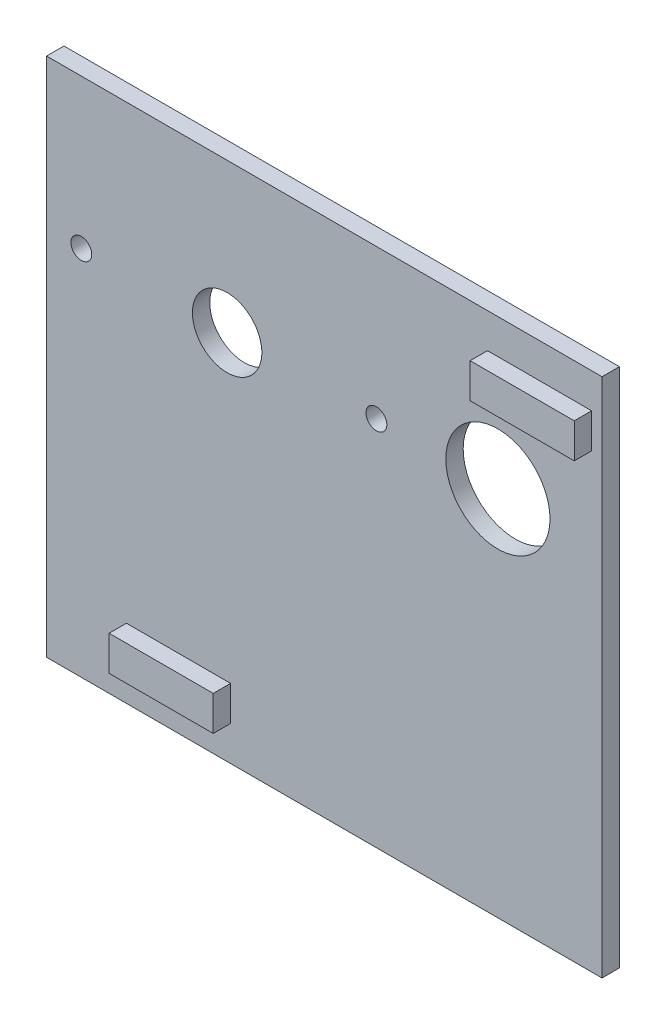
ISO-10303-21;
HEADER;
FILE_DESCRIPTION(('STEP AP214'),'2;1');
FILE_NAME('part.step','',(''),(''),'','','');
FILE_SCHEMA(('AUTOMOTIVE_DESIGN { 1 0 10303 214 1 1 1 1 }'));
ENDSEC;
DATA;
#1=APPLICATION_CONTEXT('core data for automotive mechanical design processes');
#2=APPLICATION_PROTOCOL_DEFINITION('international standard','automotive_design',2000,#1);
#3=PRODUCT_CONTEXT('',#1,'mechanical');
#4=PRODUCT('Part','Part','',(#3));
#5=PRODUCT_RELATED_PRODUCT_CATEGORY('part','',(#4));
#6=PRODUCT_DEFINITION_FORMATION('','',#4);
#7=PRODUCT_DEFINITION_CONTEXT('part definition',#1,'design');
#8=PRODUCT_DEFINITION('design','',#6,#7);
#9=PRODUCT_DEFINITION_SHAPE('','',#8);
#10=(LENGTH_UNIT() NAMED_UNIT(*) SI_UNIT(.MILLI.,.METRE.));
#11=(NAMED_UNIT(*) PLANE_ANGLE_UNIT() SI_UNIT($,.RADIAN.));
#12=(NAMED_UNIT(*) SI_UNIT($,.STERADIAN.) SOLID_ANGLE_UNIT());
#13=UNCERTAINTY_MEASURE_WITH_UNIT(LENGTH_MEASURE(1.E-05),#10,'distance_accuracy_value','');
#14=(GEOMETRIC_REPRESENTATION_CONTEXT(3) GLOBAL_UNCERTAINTY_ASSIGNED_CONTEXT((#13)) GLOBAL_UNIT_ASSIGNED_CONTEXT((#10,
#11,#12)) REPRESENTATION_CONTEXT('',''));
#15=CARTESIAN_POINT('',(0.,0.,0.));
#16=DIRECTION('',(0.,0.,1.));
#17=DIRECTION('',(1.,0.,0.));
#18=AXIS2_PLACEMENT_3D('',#15,#16,#17);
#19=CARTESIAN_POINT('',(0.,0.,5.));
#20=DIRECTION('',(0.,0.,-1.));
#21=DIRECTION('',(-1.,0.,0.));
#22=AXIS2_PLACEMENT_3D('',#19,#20,#21);
#23=PLANE('',#22);
#24=CARTESIAN_POINT('',(-150.,-43.,5.));
#25=DIRECTION('',(0.,0.,-1.));
#26=DIRECTION('',(-1.,0.,0.));
#27=AXIS2_PLACEMENT_3D('',#24,#25,#26);
#28=CIRCLE('',#27,2.99999999999999);
#29=CARTESIAN_POINT('',(-153.,-43.,5.));
#30=VERTEX_POINT('',#29);
#31=EDGE_CURVE('E231',#30,#30,#28,.T.);
#32=ORIENTED_EDGE('',*,*,#31,.T.);
#33=EDGE_LOOP('',(#32));
#34=FACE_BOUND('',#33,.T.);
#35=CARTESIAN_POINT('',(-108.,-43.,5.));
#36=DIRECTION('',(0.,0.,-1.));
#37=DIRECTION('',(-1.,0.,0.));
#38=AXIS2_PLACEMENT_3D('',#35,#36,#37);
#39=CIRCLE('',#38,9.99999999999999);
#40=CARTESIAN_POINT('',(-118.,-43.,5.));
#41=VERTEX_POINT('',#40);
#42=EDGE_CURVE('E220',#41,#41,#39,.T.);
#43=ORIENTED_EDGE('',*,*,#42,.T.);
#44=EDGE_LOOP('',(#43));
#45=FACE_BOUND('',#44,.T.);
#46=CARTESIAN_POINT('',(-65.,-43.,5.));
#47=DIRECTION('',(0.,0.,-1.));
#48=DIRECTION('',(-1.,0.,0.));
#49=AXIS2_PLACEMENT_3D('',#46,#47,#48);
#50=CIRCLE('',#49,3.00000000000001);
#51=CARTESIAN_POINT('',(-68.,-43.,5.));
#52=VERTEX_POINT('',#51);
#53=EDGE_CURVE('E217',#52,#52,#50,.T.);
#54=ORIENTED_EDGE('',*,*,#53,.T.);
#55=EDGE_LOOP('',(#54));
#56=FACE_BOUND('',#55,.T.);
#57=CARTESIAN_POINT('',(-30.,-43.,5.));
#58=DIRECTION('',(0.,0.,-1.));
#59=DIRECTION('',(-1.,0.,0.));
#60=AXIS2_PLACEMENT_3D('',#57,#58,#59);
#61=CIRCLE('',#60,15.);
#62=CARTESIAN_POINT('',(-45.,-43.,5.));
#63=VERTEX_POINT('',#62);
#64=EDGE_CURVE('E214',#63,#63,#61,.T.);
#65=ORIENTED_EDGE('',*,*,#64,.T.);
#66=EDGE_LOOP('',(#65));
#67=FACE_BOUND('',#66,.T.);
#68=DIRECTION('',(0.,-1.,0.));
#69=VECTOR('',#68,1.);
#70=CARTESIAN_POINT('',(-33.,-9.99999999999999,5.));
#71=LINE('',#70,#69);
#72=CARTESIAN_POINT('',(-33.,-9.99999999999999,5.));
#73=VERTEX_POINT('',#72);
#74=CARTESIAN_POINT('',(-33.,-20.,5.));
#75=VERTEX_POINT('',#74);
#76=EDGE_CURVE('E147',#73,#75,#71,.T.);
#77=ORIENTED_EDGE('',*,*,#76,.F.);
#78=DIRECTION('',(-1.,0.,0.));
#79=VECTOR('',#78,1.);
#80=CARTESIAN_POINT('',(-33.,-9.99999999999999,5.));
#81=LINE('',#80,#79);
#82=CARTESIAN_POINT('',(-2.99999999999998,-10.,5.));
#83=VERTEX_POINT('',#82);
#84=EDGE_CURVE('E160',#83,#73,#81,.T.);
#85=ORIENTED_EDGE('',*,*,#84,.F.);
#86=DIRECTION('',(0.,1.,0.));
#87=VECTOR('',#86,1.);
#88=CARTESIAN_POINT('',(-2.99999999999998,-10.,5.));
#89=LINE('',#88,#87);
#90=CARTESIAN_POINT('',(-2.99999999999999,-20.,5.));
#91=VERTEX_POINT('',#90);
#92=EDGE_CURVE('E169',#91,#83,#89,.T.);
#93=ORIENTED_EDGE('',*,*,#92,.F.);
#94=DIRECTION('',(1.,0.,0.));
#95=VECTOR('',#94,1.);
#96=CARTESIAN_POINT('',(-33.,-20.,5.));
#97=LINE('',#96,#95);
#98=EDGE_CURVE('E150',#75,#91,#97,.T.);
#99=ORIENTED_EDGE('',*,*,#98,.F.);
#100=EDGE_LOOP('',(#77,#85,#93,#99));
#101=FACE_BOUND('',#100,.T.);
#102=DIRECTION('',(0.,1.,0.));
#103=VECTOR('',#102,1.);
#104=CARTESIAN_POINT('',(0.,0.,5.));
#105=LINE('',#104,#103);
#106=CARTESIAN_POINT('',(0.,-150.,5.));
#107=VERTEX_POINT('',#106);
#108=CARTESIAN_POINT('',(0.,0.,5.));
#109=VERTEX_POINT('',#108);
#110=EDGE_CURVE('E186',#107,#109,#105,.T.);
#111=ORIENTED_EDGE('',*,*,#110,.T.);
#112=DIRECTION('',(-1.,0.,0.));
#113=VECTOR('',#112,1.);
#114=CARTESIAN_POINT('',(0.,0.,5.));
#115=LINE('',#114,#113);
#116=CARTESIAN_POINT('',(-160.,0.,5.));
#117=VERTEX_POINT('',#116);
#118=EDGE_CURVE('E189',#109,#117,#115,.T.);
#119=ORIENTED_EDGE('',*,*,#118,.T.);
#120=DIRECTION('',(0.,-1.,0.));
#121=VECTOR('',#120,1.);
#122=CARTESIAN_POINT('',(-160.,0.,5.));
#123=LINE('',#122,#121);
#124=CARTESIAN_POINT('',(-160.,-150.,5.));
#125=VERTEX_POINT('',#124);
#126=EDGE_CURVE('E192',#117,#125,#123,.T.);
#127=ORIENTED_EDGE('',*,*,#126,.T.);
#128=DIRECTION('',(1.,0.,0.));
#129=VECTOR('',#128,1.);
#130=CARTESIAN_POINT('',(0.,-150.,5.));
#131=LINE('',#130,#129);
#132=EDGE_CURVE('E194',#125,#107,#131,.T.);
#133=ORIENTED_EDGE('',*,*,#132,.T.);
#134=EDGE_LOOP('',(#111,#119,#127,#133));
#135=FACE_BOUND('',#134,.T.);
#136=DIRECTION('',(0.,-1.,0.));
#137=VECTOR('',#136,1.);
#138=CARTESIAN_POINT('',(-137.,-130.,5.));
#139=LINE('',#138,#137);
#140=CARTESIAN_POINT('',(-137.,-130.,5.));
#141=VERTEX_POINT('',#140);
#142=CARTESIAN_POINT('',(-137.,-140.,5.));
#143=VERTEX_POINT('',#142);
#144=EDGE_CURVE('E146',#141,#143,#139,.T.);
#145=ORIENTED_EDGE('',*,*,#144,.F.);
#146=DIRECTION('',(-1.,0.,0.));
#147=VECTOR('',#146,1.);
#148=CARTESIAN_POINT('',(-137.,-130.,5.));
#149=LINE('',#148,#147);
#150=CARTESIAN_POINT('',(-107.,-130.,5.));
#151=VERTEX_POINT('',#150);
#152=EDGE_CURVE('E143',#151,#141,#149,.T.);
#153=ORIENTED_EDGE('',*,*,#152,.F.);
#154=DIRECTION('',(0.,1.,0.));
#155=VECTOR('',#154,1.);
#156=CARTESIAN_POINT('',(-107.,-130.,5.));
#157=LINE('',#156,#155);
#158=CARTESIAN_POINT('',(-107.,-140.,5.));
#159=VERTEX_POINT('',#158);
#160=EDGE_CURVE('E57',#159,#151,#157,.T.);
#161=ORIENTED_EDGE('',*,*,#160,.F.);
#162=DIRECTION('',(1.,0.,0.));
#163=VECTOR('',#162,1.);
#164=CARTESIAN_POINT('',(-137.,-140.,5.));
#165=LINE('',#164,#163);
#166=EDGE_CURVE('E52',#143,#159,#165,.T.);
#167=ORIENTED_EDGE('',*,*,#166,.F.);
#168=EDGE_LOOP('',(#145,#153,#161,#167));
#169=FACE_BOUND('',#168,.T.);
#170=ADVANCED_FACE('F35',(#34,#45,#56,#67,#101,#135,#169),#23,.F.);
#171=CARTESIAN_POINT('',(0.,0.,5.));
#172=DIRECTION('',(-1.,0.,0.));
#173=DIRECTION('',(0.,-1.,0.));
#174=AXIS2_PLACEMENT_3D('',#171,#172,#173);
#175=PLANE('',#174);
#176=DIRECTION('',(0.,1.,0.));
#177=VECTOR('',#176,1.);
#178=CARTESIAN_POINT('',(0.,0.,0.));
#179=LINE('',#178,#177);
#180=CARTESIAN_POINT('',(0.,-150.,0.));
#181=VERTEX_POINT('',#180);
#182=CARTESIAN_POINT('',(0.,0.,0.));
#183=VERTEX_POINT('',#182);
#184=EDGE_CURVE('E185',#181,#183,#179,.T.);
#185=ORIENTED_EDGE('',*,*,#184,.T.);
#186=DIRECTION('',(0.,0.,-1.));
#187=VECTOR('',#186,1.);
#188=CARTESIAN_POINT('',(0.,0.,5.));
#189=LINE('',#188,#187);
#190=EDGE_CURVE('E11',#109,#183,#189,.T.);
#191=ORIENTED_EDGE('',*,*,#190,.F.);
#192=ORIENTED_EDGE('',*,*,#110,.F.);
#193=DIRECTION('',(0.,0.,-1.));
#194=VECTOR('',#193,1.);
#195=CARTESIAN_POINT('',(0.,-150.,5.));
#196=LINE('',#195,#194);
#197=EDGE_CURVE('E196',#107,#181,#196,.T.);
#198=ORIENTED_EDGE('',*,*,#197,.T.);
#199=EDGE_LOOP('',(#185,#191,#192,#198));
#200=FACE_BOUND('',#199,.T.);
#201=ADVANCED_FACE('F37',(#200),#175,.F.);
#202=CARTESIAN_POINT('',(0.,0.,5.));
#203=DIRECTION('',(0.,-1.,0.));
#204=DIRECTION('',(1.,0.,0.));
#205=AXIS2_PLACEMENT_3D('',#202,#203,#204);
#206=PLANE('',#205);
#207=DIRECTION('',(-1.,0.,0.));
#208=VECTOR('',#207,1.);
#209=CARTESIAN_POINT('',(0.,0.,0.));
#210=LINE('',#209,#208);
#211=CARTESIAN_POINT('',(-160.,0.,0.));
#212=VERTEX_POINT('',#211);
#213=EDGE_CURVE('E199',#183,#212,#210,.T.);
#214=ORIENTED_EDGE('',*,*,#213,.T.);
#215=DIRECTION('',(0.,0.,-1.));
#216=VECTOR('',#215,1.);
#217=CARTESIAN_POINT('',(-160.,0.,5.));
#218=LINE('',#217,#216);
#219=EDGE_CURVE('E44',#117,#212,#218,.T.);
#220=ORIENTED_EDGE('',*,*,#219,.F.);
#221=ORIENTED_EDGE('',*,*,#118,.F.);
#222=ORIENTED_EDGE('',*,*,#190,.T.);
#223=EDGE_LOOP('',(#214,#220,#221,#222));
#224=FACE_BOUND('',#223,.T.);
#225=ADVANCED_FACE('F262',(#224),#206,.F.);
#226=CARTESIAN_POINT('',(-160.,0.,5.));
#227=DIRECTION('',(1.,0.,0.));
#228=DIRECTION('',(0.,0.,-1.));
#229=AXIS2_PLACEMENT_3D('',#226,#227,#228);
#230=PLANE('',#229);
#231=DIRECTION('',(0.,-1.,0.));
#232=VECTOR('',#231,1.);
#233=CARTESIAN_POINT('',(-160.,0.,0.));
#234=LINE('',#233,#232);
#235=CARTESIAN_POINT('',(-160.,-150.,0.));
#236=VERTEX_POINT('',#235);
#237=EDGE_CURVE('E201',#212,#236,#234,.T.);
#238=ORIENTED_EDGE('',*,*,#237,.T.);
#239=DIRECTION('',(0.,0.,-1.));
#240=VECTOR('',#239,1.);
#241=CARTESIAN_POINT('',(-160.,-150.,5.));
#242=LINE('',#241,#240);
#243=EDGE_CURVE('E206',#125,#236,#242,.T.);
#244=ORIENTED_EDGE('',*,*,#243,.F.);
#245=ORIENTED_EDGE('',*,*,#126,.F.);
#246=ORIENTED_EDGE('',*,*,#219,.T.);
#247=EDGE_LOOP('',(#238,#244,#245,#246));
#248=FACE_BOUND('',#247,.T.);
#249=ADVANCED_FACE('F276',(#248),#230,.F.);
#250=CARTESIAN_POINT('',(0.,-150.,5.));
#251=DIRECTION('',(0.,1.,0.));
#252=DIRECTION('',(-1.,0.,0.));
#253=AXIS2_PLACEMENT_3D('',#250,#251,#252);
#254=PLANE('',#253);
#255=DIRECTION('',(1.,0.,0.));
#256=VECTOR('',#255,1.);
#257=CARTESIAN_POINT('',(0.,-150.,0.));
#258=LINE('',#257,#256);
#259=EDGE_CURVE('E190',#236,#181,#258,.T.);
#260=ORIENTED_EDGE('',*,*,#259,.T.);
#261=ORIENTED_EDGE('',*,*,#197,.F.);
#262=ORIENTED_EDGE('',*,*,#132,.F.);
#263=ORIENTED_EDGE('',*,*,#243,.T.);
#264=EDGE_LOOP('',(#260,#261,#262,#263));
#265=FACE_BOUND('',#264,.T.);
#266=ADVANCED_FACE('F272',(#265),#254,.F.);
#267=CARTESIAN_POINT('',(0.,0.,0.));
#268=DIRECTION('',(0.,0.,-1.));
#269=DIRECTION('',(-1.,0.,0.));
#270=AXIS2_PLACEMENT_3D('',#267,#268,#269);
#271=PLANE('',#270);
#272=CARTESIAN_POINT('',(-150.,-43.,0.));
#273=DIRECTION('',(0.,0.,-1.));
#274=DIRECTION('',(-1.,0.,0.));
#275=AXIS2_PLACEMENT_3D('',#272,#273,#274);
#276=CIRCLE('',#275,2.99999999999999);
#277=CARTESIAN_POINT('',(-153.,-43.,0.));
#278=VERTEX_POINT('',#277);
#279=EDGE_CURVE('E39',#278,#278,#276,.T.);
#280=ORIENTED_EDGE('',*,*,#279,.F.);
#281=EDGE_LOOP('',(#280));
#282=FACE_BOUND('',#281,.T.);
#283=CARTESIAN_POINT('',(-108.,-43.,0.));
#284=DIRECTION('',(0.,0.,-1.));
#285=DIRECTION('',(-1.,0.,0.));
#286=AXIS2_PLACEMENT_3D('',#283,#284,#285);
#287=CIRCLE('',#286,9.99999999999999);
#288=CARTESIAN_POINT('',(-118.,-43.,0.));
#289=VERTEX_POINT('',#288);
#290=EDGE_CURVE('E218',#289,#289,#287,.T.);
#291=ORIENTED_EDGE('',*,*,#290,.F.);
#292=EDGE_LOOP('',(#291));
#293=FACE_BOUND('',#292,.T.);
#294=CARTESIAN_POINT('',(-65.,-43.,0.));
#295=DIRECTION('',(0.,0.,-1.));
#296=DIRECTION('',(-1.,0.,0.));
#297=AXIS2_PLACEMENT_3D('',#294,#295,#296);
#298=CIRCLE('',#297,3.00000000000001);
#299=CARTESIAN_POINT('',(-68.,-43.,0.));
#300=VERTEX_POINT('',#299);
#301=EDGE_CURVE('E215',#300,#300,#298,.T.);
#302=ORIENTED_EDGE('',*,*,#301,.F.);
#303=EDGE_LOOP('',(#302));
#304=FACE_BOUND('',#303,.T.);
#305=CARTESIAN_POINT('',(-30.,-43.,0.));
#306=DIRECTION('',(0.,0.,-1.));
#307=DIRECTION('',(-1.,0.,0.));
#308=AXIS2_PLACEMENT_3D('',#305,#306,#307);
#309=CIRCLE('',#308,15.);
#310=CARTESIAN_POINT('',(-45.,-43.,0.));
#311=VERTEX_POINT('',#310);
#312=EDGE_CURVE('E211',#311,#311,#309,.T.);
#313=ORIENTED_EDGE('',*,*,#312,.F.);
#314=EDGE_LOOP('',(#313));
#315=FACE_BOUND('',#314,.T.);
#316=ORIENTED_EDGE('',*,*,#184,.F.);
#317=ORIENTED_EDGE('',*,*,#259,.F.);
#318=ORIENTED_EDGE('',*,*,#237,.F.);
#319=ORIENTED_EDGE('',*,*,#213,.F.);
#320=EDGE_LOOP('',(#316,#317,#318,#319));
#321=FACE_BOUND('',#320,.T.);
#322=ADVANCED_FACE('F269',(#282,#293,#304,#315,#321),#271,.T.);
#323=CARTESIAN_POINT('',(-33.,-9.99999999999999,10.));
#324=DIRECTION('',(1.,0.,0.));
#325=DIRECTION('',(0.,1.,0.));
#326=AXIS2_PLACEMENT_3D('',#323,#324,#325);
#327=PLANE('',#326);
#328=ORIENTED_EDGE('',*,*,#76,.T.);
#329=DIRECTION('',(0.,0.,-1.));
#330=VECTOR('',#329,1.);
#331=CARTESIAN_POINT('',(-33.,-20.,10.));
#332=LINE('',#331,#330);
#333=CARTESIAN_POINT('',(-33.,-20.,10.));
#334=VERTEX_POINT('',#333);
#335=EDGE_CURVE('E182',#334,#75,#332,.T.);
#336=ORIENTED_EDGE('',*,*,#335,.F.);
#337=DIRECTION('',(0.,-1.,0.));
#338=VECTOR('',#337,1.);
#339=CARTESIAN_POINT('',(-33.,-9.99999999999999,10.));
#340=LINE('',#339,#338);
#341=CARTESIAN_POINT('',(-33.,-9.99999999999999,10.));
#342=VERTEX_POINT('',#341);
#343=EDGE_CURVE('E156',#342,#334,#340,.T.);
#344=ORIENTED_EDGE('',*,*,#343,.F.);
#345=DIRECTION('',(0.,0.,-1.));
#346=VECTOR('',#345,1.);
#347=CARTESIAN_POINT('',(-33.,-9.99999999999999,10.));
#348=LINE('',#347,#346);
#349=EDGE_CURVE('E165',#342,#73,#348,.T.);
#350=ORIENTED_EDGE('',*,*,#349,.T.);
#351=EDGE_LOOP('',(#328,#336,#344,#350));
#352=FACE_BOUND('',#351,.T.);
#353=ADVANCED_FACE('F267',(#352),#327,.F.);
#354=CARTESIAN_POINT('',(-33.,-20.,10.));
#355=DIRECTION('',(0.,1.,0.));
#356=DIRECTION('',(-1.,0.,0.));
#357=AXIS2_PLACEMENT_3D('',#354,#355,#356);
#358=PLANE('',#357);
#359=ORIENTED_EDGE('',*,*,#98,.T.);
#360=DIRECTION('',(0.,0.,-1.));
#361=VECTOR('',#360,1.);
#362=CARTESIAN_POINT('',(-2.99999999999999,-20.,10.));
#363=LINE('',#362,#361);
#364=CARTESIAN_POINT('',(-2.99999999999999,-20.,10.));
#365=VERTEX_POINT('',#364);
#366=EDGE_CURVE('E179',#365,#91,#363,.T.);
#367=ORIENTED_EDGE('',*,*,#366,.F.);
#368=DIRECTION('',(1.,0.,0.));
#369=VECTOR('',#368,1.);
#370=CARTESIAN_POINT('',(-33.,-20.,10.));
#371=LINE('',#370,#369);
#372=EDGE_CURVE('E159',#334,#365,#371,.T.);
#373=ORIENTED_EDGE('',*,*,#372,.F.);
#374=ORIENTED_EDGE('',*,*,#335,.T.);
#375=EDGE_LOOP('',(#359,#367,#373,#374));
#376=FACE_BOUND('',#375,.T.);
#377=ADVANCED_FACE('F317',(#376),#358,.F.);
#378=CARTESIAN_POINT('',(-2.99999999999998,-10.,10.));
#379=DIRECTION('',(-1.,0.,0.));
#380=DIRECTION('',(0.,-1.,0.));
#381=AXIS2_PLACEMENT_3D('',#378,#379,#380);
#382=PLANE('',#381);
#383=ORIENTED_EDGE('',*,*,#92,.T.);
#384=DIRECTION('',(0.,0.,-1.));
#385=VECTOR('',#384,1.);
#386=CARTESIAN_POINT('',(-2.99999999999998,-10.,10.));
#387=LINE('',#386,#385);
#388=CARTESIAN_POINT('',(-2.99999999999998,-10.,10.));
#389=VERTEX_POINT('',#388);
#390=EDGE_CURVE('E176',#389,#83,#387,.T.);
#391=ORIENTED_EDGE('',*,*,#390,.F.);
#392=DIRECTION('',(0.,1.,0.));
#393=VECTOR('',#392,1.);
#394=CARTESIAN_POINT('',(-2.99999999999998,-10.,10.));
#395=LINE('',#394,#393);
#396=EDGE_CURVE('E162',#365,#389,#395,.T.);
#397=ORIENTED_EDGE('',*,*,#396,.F.);
#398=ORIENTED_EDGE('',*,*,#366,.T.);
#399=EDGE_LOOP('',(#383,#391,#397,#398));
#400=FACE_BOUND('',#399,.T.);
#401=ADVANCED_FACE('F324',(#400),#382,.F.);
#402=CARTESIAN_POINT('',(-33.,-9.99999999999999,10.));
#403=DIRECTION('',(0.,-1.,0.));
#404=DIRECTION('',(1.,0.,0.));
#405=AXIS2_PLACEMENT_3D('',#402,#403,#404);
#406=PLANE('',#405);
#407=ORIENTED_EDGE('',*,*,#84,.T.);
#408=ORIENTED_EDGE('',*,*,#349,.F.);
#409=DIRECTION('',(-1.,0.,0.));
#410=VECTOR('',#409,1.);
#411=CARTESIAN_POINT('',(-33.,-9.99999999999999,10.));
#412=LINE('',#411,#410);
#413=EDGE_CURVE('E164',#389,#342,#412,.T.);
#414=ORIENTED_EDGE('',*,*,#413,.F.);
#415=ORIENTED_EDGE('',*,*,#390,.T.);
#416=EDGE_LOOP('',(#407,#408,#414,#415));
#417=FACE_BOUND('',#416,.T.);
#418=ADVANCED_FACE('F331',(#417),#406,.F.);
#419=CARTESIAN_POINT('',(0.,0.,10.));
#420=DIRECTION('',(0.,0.,1.));
#421=DIRECTION('',(1.,0.,0.));
#422=AXIS2_PLACEMENT_3D('',#419,#420,#421);
#423=PLANE('',#422);
#424=ORIENTED_EDGE('',*,*,#343,.T.);
#425=ORIENTED_EDGE('',*,*,#372,.T.);
#426=ORIENTED_EDGE('',*,*,#396,.T.);
#427=ORIENTED_EDGE('',*,*,#413,.T.);
#428=EDGE_LOOP('',(#424,#425,#426,#427));
#429=FACE_BOUND('',#428,.T.);
#430=ADVANCED_FACE('F339',(#429),#423,.T.);
#431=CARTESIAN_POINT('',(-137.,-130.,10.));
#432=DIRECTION('',(1.,0.,0.));
#433=DIRECTION('',(0.,0.,-1.));
#434=AXIS2_PLACEMENT_3D('',#431,#432,#433);
#435=PLANE('',#434);
#436=ORIENTED_EDGE('',*,*,#144,.T.);
#437=DIRECTION('',(0.,0.,-1.));
#438=VECTOR('',#437,1.);
#439=CARTESIAN_POINT('',(-137.,-140.,10.));
#440=LINE('',#439,#438);
#441=CARTESIAN_POINT('',(-137.,-140.,10.));
#442=VERTEX_POINT('',#441);
#443=EDGE_CURVE('E127',#442,#143,#440,.T.);
#444=ORIENTED_EDGE('',*,*,#443,.F.);
#445=DIRECTION('',(0.,-1.,0.));
#446=VECTOR('',#445,1.);
#447=CARTESIAN_POINT('',(-137.,-130.,10.));
#448=LINE('',#447,#446);
#449=CARTESIAN_POINT('',(-137.,-130.,10.));
#450=VERTEX_POINT('',#449);
#451=EDGE_CURVE('E134',#450,#442,#448,.T.);
#452=ORIENTED_EDGE('',*,*,#451,.F.);
#453=DIRECTION('',(0.,0.,-1.));
#454=VECTOR('',#453,1.);
#455=CARTESIAN_POINT('',(-137.,-130.,10.));
#456=LINE('',#455,#454);
#457=EDGE_CURVE('E236',#450,#141,#456,.T.);
#458=ORIENTED_EDGE('',*,*,#457,.T.);
#459=EDGE_LOOP('',(#436,#444,#452,#458));
#460=FACE_BOUND('',#459,.T.);
#461=ADVANCED_FACE('F145',(#460),#435,.F.);
#462=CARTESIAN_POINT('',(-137.,-140.,10.));
#463=DIRECTION('',(0.,1.,0.));
#464=DIRECTION('',(0.,0.,1.));
#465=AXIS2_PLACEMENT_3D('',#462,#463,#464);
#466=PLANE('',#465);
#467=ORIENTED_EDGE('',*,*,#166,.T.);
#468=DIRECTION('',(0.,0.,-1.));
#469=VECTOR('',#468,1.);
#470=CARTESIAN_POINT('',(-107.,-140.,10.));
#471=LINE('',#470,#469);
#472=CARTESIAN_POINT('',(-107.,-140.,10.));
#473=VERTEX_POINT('',#472);
#474=EDGE_CURVE('E130',#473,#159,#471,.T.);
#475=ORIENTED_EDGE('',*,*,#474,.F.);
#476=DIRECTION('',(1.,0.,0.));
#477=VECTOR('',#476,1.);
#478=CARTESIAN_POINT('',(-137.,-140.,10.));
#479=LINE('',#478,#477);
#480=EDGE_CURVE('E123',#442,#473,#479,.T.);
#481=ORIENTED_EDGE('',*,*,#480,.F.);
#482=ORIENTED_EDGE('',*,*,#443,.T.);
#483=EDGE_LOOP('',(#467,#475,#481,#482));
#484=FACE_BOUND('',#483,.T.);
#485=ADVANCED_FACE('F125',(#484),#466,.F.);
#486=CARTESIAN_POINT('',(-107.,-130.,10.));
#487=DIRECTION('',(-1.,0.,0.));
#488=DIRECTION('',(0.,0.,1.));
#489=AXIS2_PLACEMENT_3D('',#486,#487,#488);
#490=PLANE('',#489);
#491=ORIENTED_EDGE('',*,*,#160,.T.);
#492=DIRECTION('',(0.,0.,-1.));
#493=VECTOR('',#492,1.);
#494=CARTESIAN_POINT('',(-107.,-130.,10.));
#495=LINE('',#494,#493);
#496=CARTESIAN_POINT('',(-107.,-130.,10.));
#497=VERTEX_POINT('',#496);
#498=EDGE_CURVE('E152',#497,#151,#495,.T.);
#499=ORIENTED_EDGE('',*,*,#498,.F.);
#500=DIRECTION('',(0.,1.,0.));
#501=VECTOR('',#500,1.);
#502=CARTESIAN_POINT('',(-107.,-130.,10.));
#503=LINE('',#502,#501);
#504=EDGE_CURVE('E133',#473,#497,#503,.T.);
#505=ORIENTED_EDGE('',*,*,#504,.F.);
#506=ORIENTED_EDGE('',*,*,#474,.T.);
#507=EDGE_LOOP('',(#491,#499,#505,#506));
#508=FACE_BOUND('',#507,.T.);
#509=ADVANCED_FACE('F247',(#508),#490,.F.);
#510=CARTESIAN_POINT('',(-137.,-130.,10.));
#511=DIRECTION('',(0.,-1.,0.));
#512=DIRECTION('',(0.,0.,-1.));
#513=AXIS2_PLACEMENT_3D('',#510,#511,#512);
#514=PLANE('',#513);
#515=ORIENTED_EDGE('',*,*,#152,.T.);
#516=ORIENTED_EDGE('',*,*,#457,.F.);
#517=DIRECTION('',(-1.,0.,0.));
#518=VECTOR('',#517,1.);
#519=CARTESIAN_POINT('',(-137.,-130.,10.));
#520=LINE('',#519,#518);
#521=EDGE_CURVE('E139',#497,#450,#520,.T.);
#522=ORIENTED_EDGE('',*,*,#521,.F.);
#523=ORIENTED_EDGE('',*,*,#498,.T.);
#524=EDGE_LOOP('',(#515,#516,#522,#523));
#525=FACE_BOUND('',#524,.T.);
#526=ADVANCED_FACE('F245',(#525),#514,.F.);
#527=CARTESIAN_POINT('',(0.,0.,10.));
#528=DIRECTION('',(0.,0.,1.));
#529=DIRECTION('',(1.,0.,0.));
#530=AXIS2_PLACEMENT_3D('',#527,#528,#529);
#531=PLANE('',#530);
#532=ORIENTED_EDGE('',*,*,#451,.T.);
#533=ORIENTED_EDGE('',*,*,#480,.T.);
#534=ORIENTED_EDGE('',*,*,#504,.T.);
#535=ORIENTED_EDGE('',*,*,#521,.T.);
#536=EDGE_LOOP('',(#532,#533,#534,#535));
#537=FACE_BOUND('',#536,.T.);
#538=ADVANCED_FACE('F137',(#537),#531,.T.);
#539=CARTESIAN_POINT('',(-30.,-43.,-5.));
#540=DIRECTION('',(0.,0.,1.));
#541=DIRECTION('',(1.,0.,0.));
#542=AXIS2_PLACEMENT_3D('',#539,#540,#541);
#543=CYLINDRICAL_SURFACE('',#542,15.);
#544=ORIENTED_EDGE('',*,*,#312,.T.);
#545=EDGE_LOOP('',(#544));
#546=FACE_BOUND('',#545,.T.);
#547=ORIENTED_EDGE('',*,*,#64,.F.);
#548=EDGE_LOOP('',(#547));
#549=FACE_BOUND('',#548,.T.);
#550=ADVANCED_FACE('F376',(#546,#549),#543,.F.);
#551=CARTESIAN_POINT('',(-65.,-43.,-5.));
#552=DIRECTION('',(0.,0.,1.));
#553=DIRECTION('',(1.,0.,0.));
#554=AXIS2_PLACEMENT_3D('',#551,#552,#553);
#555=CYLINDRICAL_SURFACE('',#554,3.00000000000001);
#556=ORIENTED_EDGE('',*,*,#301,.T.);
#557=EDGE_LOOP('',(#556));
#558=FACE_BOUND('',#557,.T.);
#559=ORIENTED_EDGE('',*,*,#53,.F.);
#560=EDGE_LOOP('',(#559));
#561=FACE_BOUND('',#560,.T.);
#562=ADVANCED_FACE('F413',(#558,#561),#555,.F.);
#563=CARTESIAN_POINT('',(-108.,-43.,-5.));
#564=DIRECTION('',(0.,0.,1.));
#565=DIRECTION('',(1.,0.,0.));
#566=AXIS2_PLACEMENT_3D('',#563,#564,#565);
#567=CYLINDRICAL_SURFACE('',#566,9.99999999999999);
#568=ORIENTED_EDGE('',*,*,#290,.T.);
#569=EDGE_LOOP('',(#568));
#570=FACE_BOUND('',#569,.T.);
#571=ORIENTED_EDGE('',*,*,#42,.F.);
#572=EDGE_LOOP('',(#571));
#573=FACE_BOUND('',#572,.T.);
#574=ADVANCED_FACE('F420',(#570,#573),#567,.F.);
#575=CARTESIAN_POINT('',(-150.,-43.,-5.));
#576=DIRECTION('',(0.,0.,1.));
#577=DIRECTION('',(1.,0.,0.));
#578=AXIS2_PLACEMENT_3D('',#575,#576,#577);
#579=CYLINDRICAL_SURFACE('',#578,2.99999999999999);
#580=ORIENTED_EDGE('',*,*,#279,.T.);
#581=EDGE_LOOP('',(#580));
#582=FACE_BOUND('',#581,.T.);
#583=ORIENTED_EDGE('',*,*,#31,.F.);
#584=EDGE_LOOP('',(#583));
#585=FACE_BOUND('',#584,.T.);
#586=ADVANCED_FACE('F428',(#582,#585),#579,.F.);
#587=CLOSED_SHELL('',(#170,#201,#225,#249,#266,#322,#353,#377,#401,#418,#430,#461,#485,#509,
#526,#538,#550,#562,#574,#586));
#588=MANIFOLD_SOLID_BREP('B2',#587);
#589=ADVANCED_BREP_SHAPE_REPRESENTATION('',(#18,#588),#14);
#590=SHAPE_DEFINITION_REPRESENTATION(#9,#589);
ENDSEC;
END-ISO-10303-21;
